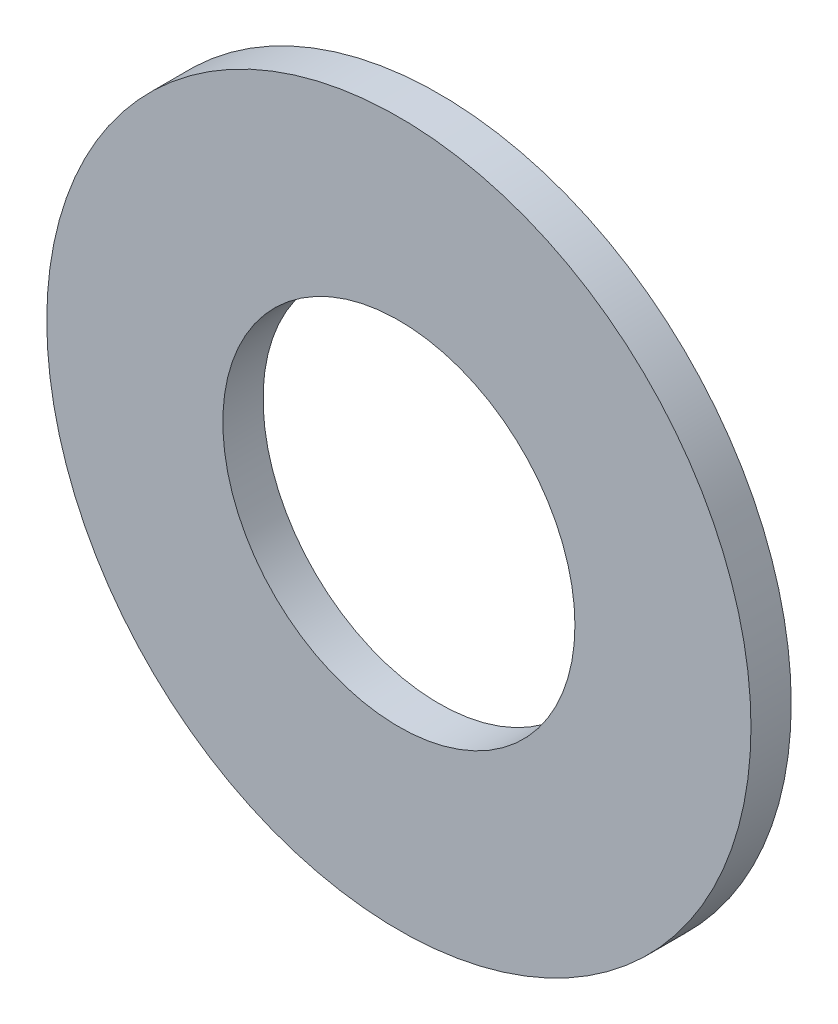
ISO-10303-21;
HEADER;
FILE_DESCRIPTION(('STEP AP214'),'2;1');
FILE_NAME('part.step','',(''),(''),'','','');
FILE_SCHEMA(('AUTOMOTIVE_DESIGN { 1 0 10303 214 1 1 1 1 }'));
ENDSEC;
DATA;
#1=APPLICATION_CONTEXT('core data for automotive mechanical design processes');
#2=APPLICATION_PROTOCOL_DEFINITION('international standard','automotive_design',2000,#1);
#3=PRODUCT_CONTEXT('',#1,'mechanical');
#4=PRODUCT('Part','Part','',(#3));
#5=PRODUCT_RELATED_PRODUCT_CATEGORY('part','',(#4));
#6=PRODUCT_DEFINITION_FORMATION('','',#4);
#7=PRODUCT_DEFINITION_CONTEXT('part definition',#1,'design');
#8=PRODUCT_DEFINITION('design','',#6,#7);
#9=PRODUCT_DEFINITION_SHAPE('','',#8);
#10=(LENGTH_UNIT() NAMED_UNIT(*) SI_UNIT(.MILLI.,.METRE.));
#11=(NAMED_UNIT(*) PLANE_ANGLE_UNIT() SI_UNIT($,.RADIAN.));
#12=(NAMED_UNIT(*) SI_UNIT($,.STERADIAN.) SOLID_ANGLE_UNIT());
#13=UNCERTAINTY_MEASURE_WITH_UNIT(LENGTH_MEASURE(1.E-05),#10,'distance_accuracy_value','');
#14=(GEOMETRIC_REPRESENTATION_CONTEXT(3) GLOBAL_UNCERTAINTY_ASSIGNED_CONTEXT((#13)) GLOBAL_UNIT_ASSIGNED_CONTEXT((#10,
#11,#12)) REPRESENTATION_CONTEXT('',''));
#15=CARTESIAN_POINT('',(0.,0.,0.));
#16=DIRECTION('',(0.,0.,1.));
#17=DIRECTION('',(1.,0.,0.));
#18=AXIS2_PLACEMENT_3D('',#15,#16,#17);
#19=CARTESIAN_POINT('',(0.,0.,0.4));
#20=DIRECTION('',(0.,0.,1.));
#21=DIRECTION('',(1.,0.,0.));
#22=AXIS2_PLACEMENT_3D('',#19,#20,#21);
#23=PLANE('',#22);
#24=CARTESIAN_POINT('',(0.,0.,0.4));
#25=DIRECTION('',(0.,0.,1.));
#26=DIRECTION('',(1.,0.,0.));
#27=AXIS2_PLACEMENT_3D('',#24,#25,#26);
#28=CIRCLE('',#27,3.5);
#29=CARTESIAN_POINT('',(3.5,0.,0.4));
#30=VERTEX_POINT('',#29);
#31=EDGE_CURVE('E10',#30,#30,#28,.T.);
#32=ORIENTED_EDGE('',*,*,#31,.T.);
#33=EDGE_LOOP('',(#32));
#34=FACE_BOUND('',#33,.T.);
#35=CARTESIAN_POINT('',(0.,0.,0.4));
#36=DIRECTION('',(0.,0.,1.));
#37=DIRECTION('',(1.,0.,0.));
#38=AXIS2_PLACEMENT_3D('',#35,#36,#37);
#39=CIRCLE('',#38,1.75);
#40=CARTESIAN_POINT('',(1.75,0.,0.4));
#41=VERTEX_POINT('',#40);
#42=EDGE_CURVE('E42',#41,#41,#39,.T.);
#43=ORIENTED_EDGE('',*,*,#42,.F.);
#44=EDGE_LOOP('',(#43));
#45=FACE_BOUND('',#44,.T.);
#46=ADVANCED_FACE('F31',(#34,#45),#23,.T.);
#47=CARTESIAN_POINT('',(0.,0.,0.));
#48=DIRECTION('',(0.,0.,1.));
#49=DIRECTION('',(1.,0.,0.));
#50=AXIS2_PLACEMENT_3D('',#47,#48,#49);
#51=PLANE('',#50);
#52=CARTESIAN_POINT('',(0.,0.,0.));
#53=DIRECTION('',(0.,0.,1.));
#54=DIRECTION('',(1.,0.,0.));
#55=AXIS2_PLACEMENT_3D('',#52,#53,#54);
#56=CIRCLE('',#55,3.5);
#57=CARTESIAN_POINT('',(3.5,0.,0.));
#58=VERTEX_POINT('',#57);
#59=EDGE_CURVE('E35',#58,#58,#56,.T.);
#60=ORIENTED_EDGE('',*,*,#59,.F.);
#61=EDGE_LOOP('',(#60));
#62=FACE_BOUND('',#61,.T.);
#63=CARTESIAN_POINT('',(0.,0.,0.));
#64=DIRECTION('',(0.,0.,1.));
#65=DIRECTION('',(1.,0.,0.));
#66=AXIS2_PLACEMENT_3D('',#63,#64,#65);
#67=CIRCLE('',#66,1.75);
#68=CARTESIAN_POINT('',(1.75,0.,0.));
#69=VERTEX_POINT('',#68);
#70=EDGE_CURVE('E44',#69,#69,#67,.T.);
#71=ORIENTED_EDGE('',*,*,#70,.T.);
#72=EDGE_LOOP('',(#71));
#73=FACE_BOUND('',#72,.T.);
#74=ADVANCED_FACE('F54',(#62,#73),#51,.F.);
#75=CARTESIAN_POINT('',(0.,0.,0.4));
#76=DIRECTION('',(0.,0.,-1.));
#77=DIRECTION('',(-1.,0.,0.));
#78=AXIS2_PLACEMENT_3D('',#75,#76,#77);
#79=CYLINDRICAL_SURFACE('',#78,3.5);
#80=ORIENTED_EDGE('',*,*,#31,.F.);
#81=EDGE_LOOP('',(#80));
#82=FACE_BOUND('',#81,.T.);
#83=ORIENTED_EDGE('',*,*,#59,.T.);
#84=EDGE_LOOP('',(#83));
#85=FACE_BOUND('',#84,.T.);
#86=ADVANCED_FACE('F33',(#82,#85),#79,.T.);
#87=CARTESIAN_POINT('',(0.,0.,0.4));
#88=DIRECTION('',(0.,0.,-1.));
#89=DIRECTION('',(-1.,0.,0.));
#90=AXIS2_PLACEMENT_3D('',#87,#88,#89);
#91=CYLINDRICAL_SURFACE('',#90,1.75);
#92=ORIENTED_EDGE('',*,*,#42,.T.);
#93=EDGE_LOOP('',(#92));
#94=FACE_BOUND('',#93,.T.);
#95=ORIENTED_EDGE('',*,*,#70,.F.);
#96=EDGE_LOOP('',(#95));
#97=FACE_BOUND('',#96,.T.);
#98=ADVANCED_FACE('F50',(#94,#97),#91,.F.);
#99=CLOSED_SHELL('',(#46,#74,#86,#98));
#100=MANIFOLD_SOLID_BREP('B2',#99);
#101=ADVANCED_BREP_SHAPE_REPRESENTATION('',(#18,#100),#14);
#102=SHAPE_DEFINITION_REPRESENTATION(#9,#101);
ENDSEC;
END-ISO-10303-21;
